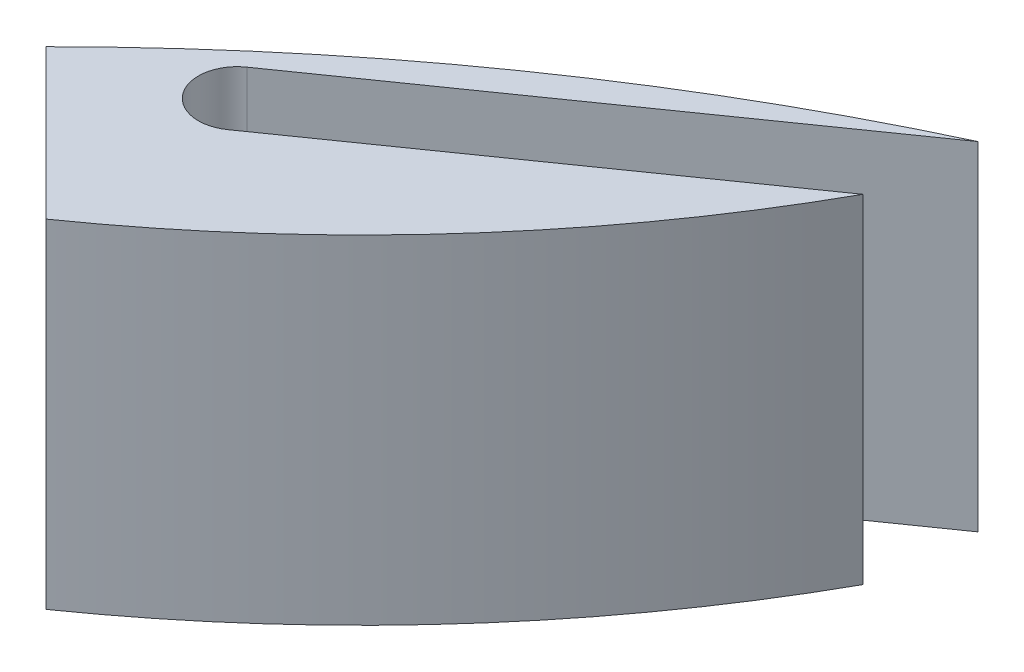
ISO-10303-21;
HEADER;
FILE_DESCRIPTION(('STEP AP214'),'2;1');
FILE_NAME('part.step','',(''),(''),'','','');
FILE_SCHEMA(('AUTOMOTIVE_DESIGN { 1 0 10303 214 1 1 1 1 }'));
ENDSEC;
DATA;
#1=APPLICATION_CONTEXT('core data for automotive mechanical design processes');
#2=APPLICATION_PROTOCOL_DEFINITION('international standard','automotive_design',2000,#1);
#3=PRODUCT_CONTEXT('',#1,'mechanical');
#4=PRODUCT('Part','Part','',(#3));
#5=PRODUCT_RELATED_PRODUCT_CATEGORY('part','',(#4));
#6=PRODUCT_DEFINITION_FORMATION('','',#4);
#7=PRODUCT_DEFINITION_CONTEXT('part definition',#1,'design');
#8=PRODUCT_DEFINITION('design','',#6,#7);
#9=PRODUCT_DEFINITION_SHAPE('','',#8);
#10=(LENGTH_UNIT() NAMED_UNIT(*) SI_UNIT(.MILLI.,.METRE.));
#11=(NAMED_UNIT(*) PLANE_ANGLE_UNIT() SI_UNIT($,.RADIAN.));
#12=(NAMED_UNIT(*) SI_UNIT($,.STERADIAN.) SOLID_ANGLE_UNIT());
#13=UNCERTAINTY_MEASURE_WITH_UNIT(LENGTH_MEASURE(1.E-05),#10,'distance_accuracy_value','');
#14=(GEOMETRIC_REPRESENTATION_CONTEXT(3) GLOBAL_UNCERTAINTY_ASSIGNED_CONTEXT((#13)) GLOBAL_UNIT_ASSIGNED_CONTEXT((#10,
#11,#12)) REPRESENTATION_CONTEXT('',''));
#15=CARTESIAN_POINT('',(0.,0.,0.));
#16=DIRECTION('',(0.,0.,1.));
#17=DIRECTION('',(1.,0.,0.));
#18=AXIS2_PLACEMENT_3D('',#15,#16,#17);
#19=CARTESIAN_POINT('',(0.,5.,0.));
#20=DIRECTION('',(0.,-1.,0.));
#21=DIRECTION('',(0.,0.,-1.));
#22=AXIS2_PLACEMENT_3D('',#19,#20,#21);
#23=CYLINDRICAL_SURFACE('',#22,57.);
#24=CARTESIAN_POINT('',(0.,-5.,0.));
#25=DIRECTION('',(0.,1.,0.));
#26=DIRECTION('',(0.,0.,-1.));
#27=AXIS2_PLACEMENT_3D('',#24,#25,#26);
#28=CIRCLE('',#27,57.);
#29=CARTESIAN_POINT('',(-24.0892409192198,-5.,-51.6595438610891));
#30=VERTEX_POINT('',#29);
#31=CARTESIAN_POINT('',(-40.3050865276332,-5.,-40.3050865276332));
#32=VERTEX_POINT('',#31);
#33=EDGE_CURVE('E121',#30,#32,#28,.T.);
#34=ORIENTED_EDGE('',*,*,#33,.T.);
#35=DIRECTION('',(0.,-1.,0.));
#36=VECTOR('',#35,1.);
#37=CARTESIAN_POINT('',(-40.3050865276332,5.,-40.3050865276332));
#38=LINE('',#37,#36);
#39=CARTESIAN_POINT('',(-40.3050865276332,5.,-40.3050865276332));
#40=VERTEX_POINT('',#39);
#41=EDGE_CURVE('E11',#40,#32,#38,.T.);
#42=ORIENTED_EDGE('',*,*,#41,.F.);
#43=CARTESIAN_POINT('',(0.,5.,0.));
#44=DIRECTION('',(0.,1.,0.));
#45=DIRECTION('',(0.,0.,-1.));
#46=AXIS2_PLACEMENT_3D('',#43,#44,#45);
#47=CIRCLE('',#46,57.);
#48=CARTESIAN_POINT('',(-24.0892409192198,5.,-51.6595438610891));
#49=VERTEX_POINT('',#48);
#50=EDGE_CURVE('E131',#49,#40,#47,.T.);
#51=ORIENTED_EDGE('',*,*,#50,.F.);
#52=DIRECTION('',(0.,-1.,0.));
#53=VECTOR('',#52,1.);
#54=CARTESIAN_POINT('',(-24.0892409192198,5.,-51.6595438610891));
#55=LINE('',#54,#53);
#56=EDGE_CURVE('E117',#49,#30,#55,.T.);
#57=ORIENTED_EDGE('',*,*,#56,.T.);
#58=EDGE_LOOP('',(#34,#42,#51,#57));
#59=FACE_BOUND('',#58,.T.);
#60=ADVANCED_FACE('F37',(#59),#23,.T.);
#61=CARTESIAN_POINT('',(-40.3050865276332,5.,-40.3050865276332));
#62=DIRECTION('',(0.707106781186547,0.,-0.707106781186548));
#63=DIRECTION('',(-0.707106781186548,0.,-0.707106781186547));
#64=AXIS2_PLACEMENT_3D('',#61,#62,#63);
#65=PLANE('',#64);
#66=DIRECTION('',(0.707106781186548,0.,0.707106781186547));
#67=VECTOR('',#66,1.);
#68=CARTESIAN_POINT('',(-40.3050865276332,-5.,-40.3050865276332));
#69=LINE('',#68,#67);
#70=CARTESIAN_POINT('',(-35.8892940128038,-5.,-35.8892940128038));
#71=VERTEX_POINT('',#70);
#72=EDGE_CURVE('E124',#32,#71,#69,.T.);
#73=ORIENTED_EDGE('',*,*,#72,.T.);
#74=DIRECTION('',(0.,-1.,0.));
#75=VECTOR('',#74,1.);
#76=CARTESIAN_POINT('',(-35.8892940128038,5.,-35.8892940128038));
#77=LINE('',#76,#75);
#78=CARTESIAN_POINT('',(-35.8892940128038,5.,-35.8892940128038));
#79=VERTEX_POINT('',#78);
#80=EDGE_CURVE('E45',#79,#71,#77,.T.);
#81=ORIENTED_EDGE('',*,*,#80,.F.);
#82=DIRECTION('',(0.707106781186548,0.,0.707106781186547));
#83=VECTOR('',#82,1.);
#84=CARTESIAN_POINT('',(-40.3050865276332,5.,-40.3050865276332));
#85=LINE('',#84,#83);
#86=EDGE_CURVE('E90',#40,#79,#85,.T.);
#87=ORIENTED_EDGE('',*,*,#86,.F.);
#88=ORIENTED_EDGE('',*,*,#41,.T.);
#89=EDGE_LOOP('',(#73,#81,#87,#88));
#90=FACE_BOUND('',#89,.T.);
#91=ADVANCED_FACE('F155',(#90),#65,.F.);
#92=CARTESIAN_POINT('',(-57.6937634960195,5.,-67.0293036433275));
#93=DIRECTION('',(0.,-1.,0.));
#94=DIRECTION('',(0.,0.,-1.));
#95=AXIS2_PLACEMENT_3D('',#92,#93,#94);
#96=CYLINDRICAL_SURFACE('',#95,38.0149324507303);
#97=CARTESIAN_POINT('',(-57.6937634960195,-5.,-67.0293036433275));
#98=DIRECTION('',(0.,1.,0.));
#99=DIRECTION('',(0.,0.,-1.));
#100=AXIS2_PLACEMENT_3D('',#97,#98,#99);
#101=CIRCLE('',#100,38.0149324507303);
#102=CARTESIAN_POINT('',(-24.4422107585823,-5.,-48.6046101646555));
#103=VERTEX_POINT('',#102);
#104=EDGE_CURVE('E126',#71,#103,#101,.T.);
#105=ORIENTED_EDGE('',*,*,#104,.T.);
#106=DIRECTION('',(0.,-1.,0.));
#107=VECTOR('',#106,1.);
#108=CARTESIAN_POINT('',(-24.4422107585823,5.,-48.6046101646555));
#109=LINE('',#108,#107);
#110=CARTESIAN_POINT('',(-24.4422107585823,5.,-48.6046101646555));
#111=VERTEX_POINT('',#110);
#112=EDGE_CURVE('E112',#111,#103,#109,.T.);
#113=ORIENTED_EDGE('',*,*,#112,.F.);
#114=CARTESIAN_POINT('',(-57.6937634960195,5.,-67.0293036433275));
#115=DIRECTION('',(0.,1.,0.));
#116=DIRECTION('',(0.,0.,-1.));
#117=AXIS2_PLACEMENT_3D('',#114,#115,#116);
#118=CIRCLE('',#117,38.0149324507303);
#119=EDGE_CURVE('E103',#79,#111,#118,.T.);
#120=ORIENTED_EDGE('',*,*,#119,.F.);
#121=ORIENTED_EDGE('',*,*,#80,.T.);
#122=EDGE_LOOP('',(#105,#113,#120,#121));
#123=FACE_BOUND('',#122,.T.);
#124=ADVANCED_FACE('F137',(#123),#96,.T.);
#125=CARTESIAN_POINT('',(-35.492601186502,5.,-40.8670434868657));
#126=DIRECTION('',(0.573576436351046,0.,0.819152044288992));
#127=DIRECTION('',(0.819152044288992,0.,-0.573576436351046));
#128=AXIS2_PLACEMENT_3D('',#125,#126,#127);
#129=PLANE('',#128);
#130=DIRECTION('',(-0.819152044288992,0.,0.573576436351046));
#131=VECTOR('',#130,1.);
#132=CARTESIAN_POINT('',(-35.492601186502,-5.,-40.8670434868657));
#133=LINE('',#132,#131);
#134=CARTESIAN_POINT('',(-35.492601186502,-5.,-40.8670434868657));
#135=VERTEX_POINT('',#134);
#136=EDGE_CURVE('E111',#103,#135,#133,.T.);
#137=ORIENTED_EDGE('',*,*,#136,.T.);
#138=DIRECTION('',(0.,-1.,0.));
#139=VECTOR('',#138,1.);
#140=CARTESIAN_POINT('',(-35.492601186502,5.,-40.8670434868657));
#141=LINE('',#140,#139);
#142=CARTESIAN_POINT('',(-35.492601186502,5.,-40.8670434868657));
#143=VERTEX_POINT('',#142);
#144=EDGE_CURVE('E108',#143,#135,#141,.T.);
#145=ORIENTED_EDGE('',*,*,#144,.F.);
#146=DIRECTION('',(-0.819152044288992,0.,0.573576436351046));
#147=VECTOR('',#146,1.);
#148=CARTESIAN_POINT('',(-35.492601186502,5.,-40.8670434868657));
#149=LINE('',#148,#147);
#150=EDGE_CURVE('E97',#111,#143,#149,.T.);
#151=ORIENTED_EDGE('',*,*,#150,.F.);
#152=ORIENTED_EDGE('',*,*,#112,.T.);
#153=EDGE_LOOP('',(#137,#145,#151,#152));
#154=FACE_BOUND('',#153,.T.);
#155=ADVANCED_FACE('F109',(#154),#129,.F.);
#156=CARTESIAN_POINT('',(-36.1522140883057,5.,-41.809068337798));
#157=DIRECTION('',(0.,-1.,0.));
#158=DIRECTION('',(0.,0.,-1.));
#159=AXIS2_PLACEMENT_3D('',#156,#157,#158);
#160=CYLINDRICAL_SURFACE('',#159,1.15);
#161=CARTESIAN_POINT('',(-36.1522140883057,-5.,-41.809068337798));
#162=DIRECTION('',(0.,-1.,0.));
#163=DIRECTION('',(0.,0.,-1.));
#164=AXIS2_PLACEMENT_3D('',#161,#162,#163);
#165=CIRCLE('',#164,1.15);
#166=CARTESIAN_POINT('',(-36.8118269901094,-5.,-42.7510931887304));
#167=VERTEX_POINT('',#166);
#168=EDGE_CURVE('E76',#135,#167,#165,.T.);
#169=ORIENTED_EDGE('',*,*,#168,.T.);
#170=DIRECTION('',(0.,-1.,0.));
#171=VECTOR('',#170,1.);
#172=CARTESIAN_POINT('',(-36.8118269901094,5.,-42.7510931887304));
#173=LINE('',#172,#171);
#174=CARTESIAN_POINT('',(-36.8118269901094,5.,-42.7510931887304));
#175=VERTEX_POINT('',#174);
#176=EDGE_CURVE('E113',#175,#167,#173,.T.);
#177=ORIENTED_EDGE('',*,*,#176,.F.);
#178=CARTESIAN_POINT('',(-36.1522140883057,5.,-41.809068337798));
#179=DIRECTION('',(0.,-1.,0.));
#180=DIRECTION('',(0.,0.,-1.));
#181=AXIS2_PLACEMENT_3D('',#178,#179,#180);
#182=CIRCLE('',#181,1.15);
#183=EDGE_CURVE('E101',#143,#175,#182,.T.);
#184=ORIENTED_EDGE('',*,*,#183,.F.);
#185=ORIENTED_EDGE('',*,*,#144,.T.);
#186=EDGE_LOOP('',(#169,#177,#184,#185));
#187=FACE_BOUND('',#186,.T.);
#188=ADVANCED_FACE('F115',(#187),#160,.F.);
#189=CARTESIAN_POINT('',(-36.8118269901094,5.,-42.7510931887304));
#190=DIRECTION('',(-0.573576436351045,0.,-0.819152044288992));
#191=DIRECTION('',(-0.819152044288992,0.,0.573576436351045));
#192=AXIS2_PLACEMENT_3D('',#189,#190,#191);
#193=PLANE('',#192);
#194=DIRECTION('',(0.819152044288992,0.,-0.573576436351045));
#195=VECTOR('',#194,1.);
#196=CARTESIAN_POINT('',(-36.8118269901094,-5.,-42.7510931887304));
#197=LINE('',#196,#195);
#198=EDGE_CURVE('E82',#167,#30,#197,.T.);
#199=ORIENTED_EDGE('',*,*,#198,.T.);
#200=ORIENTED_EDGE('',*,*,#56,.F.);
#201=DIRECTION('',(0.819152044288992,0.,-0.573576436351045));
#202=VECTOR('',#201,1.);
#203=CARTESIAN_POINT('',(-36.8118269901094,5.,-42.7510931887304));
#204=LINE('',#203,#202);
#205=EDGE_CURVE('E53',#175,#49,#204,.T.);
#206=ORIENTED_EDGE('',*,*,#205,.F.);
#207=ORIENTED_EDGE('',*,*,#176,.T.);
#208=EDGE_LOOP('',(#199,#200,#206,#207));
#209=FACE_BOUND('',#208,.T.);
#210=ADVANCED_FACE('F144',(#209),#193,.F.);
#211=CARTESIAN_POINT('',(0.,5.,0.));
#212=DIRECTION('',(0.,-1.,0.));
#213=DIRECTION('',(0.,0.,-1.));
#214=AXIS2_PLACEMENT_3D('',#211,#212,#213);
#215=PLANE('',#214);
#216=ORIENTED_EDGE('',*,*,#50,.T.);
#217=ORIENTED_EDGE('',*,*,#86,.T.);
#218=ORIENTED_EDGE('',*,*,#119,.T.);
#219=ORIENTED_EDGE('',*,*,#150,.T.);
#220=ORIENTED_EDGE('',*,*,#183,.T.);
#221=ORIENTED_EDGE('',*,*,#205,.T.);
#222=EDGE_LOOP('',(#216,#217,#218,#219,#220,#221));
#223=FACE_BOUND('',#222,.T.);
#224=ADVANCED_FACE('F99',(#223),#215,.F.);
#225=CARTESIAN_POINT('',(0.,-5.,0.));
#226=DIRECTION('',(0.,-1.,0.));
#227=DIRECTION('',(0.,0.,-1.));
#228=AXIS2_PLACEMENT_3D('',#225,#226,#227);
#229=PLANE('',#228);
#230=ORIENTED_EDGE('',*,*,#33,.F.);
#231=ORIENTED_EDGE('',*,*,#198,.F.);
#232=ORIENTED_EDGE('',*,*,#168,.F.);
#233=ORIENTED_EDGE('',*,*,#136,.F.);
#234=ORIENTED_EDGE('',*,*,#104,.F.);
#235=ORIENTED_EDGE('',*,*,#72,.F.);
#236=EDGE_LOOP('',(#230,#231,#232,#233,#234,#235));
#237=FACE_BOUND('',#236,.T.);
#238=ADVANCED_FACE('F140',(#237),#229,.T.);
#239=CLOSED_SHELL('',(#60,#91,#124,#155,#188,#210,#224,#238));
#240=MANIFOLD_SOLID_BREP('B2',#239);
#241=ADVANCED_BREP_SHAPE_REPRESENTATION('',(#18,#240),#14);
#242=SHAPE_DEFINITION_REPRESENTATION(#9,#241);
ENDSEC;
END-ISO-10303-21;
